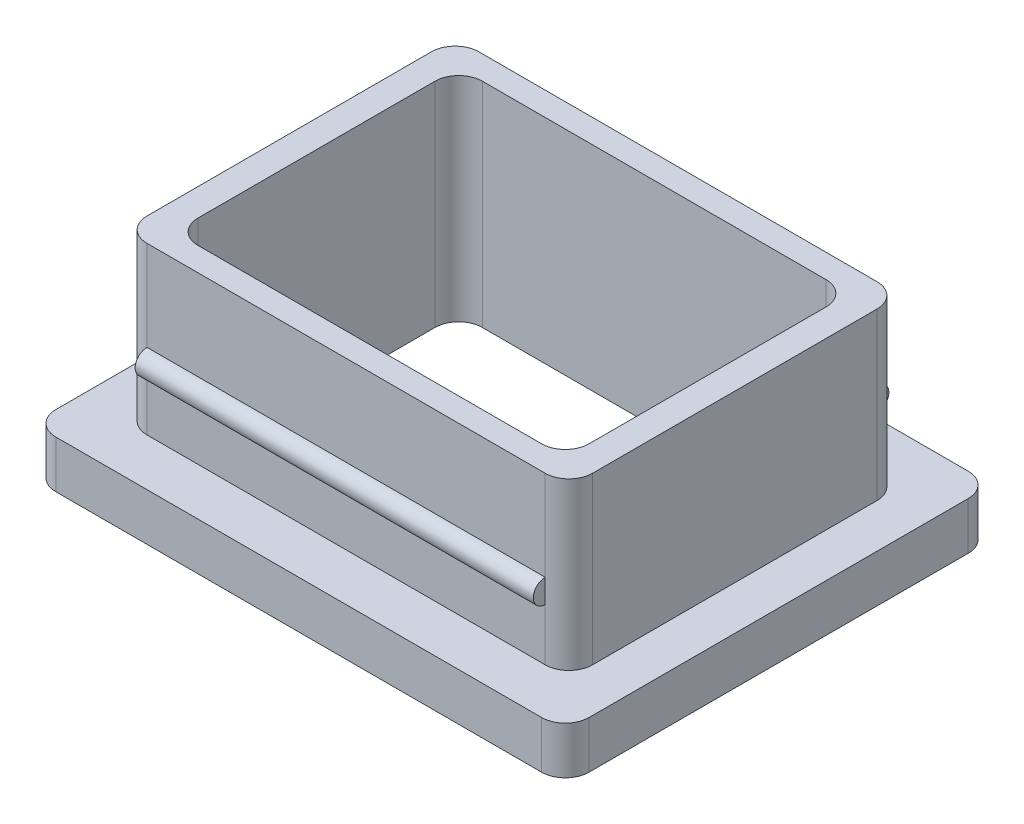
ISO-10303-21;
HEADER;
FILE_DESCRIPTION(('STEP AP214'),'2;1');
FILE_NAME('part.step','',(''),(''),'','','');
FILE_SCHEMA(('AUTOMOTIVE_DESIGN { 1 0 10303 214 1 1 1 1 }'));
ENDSEC;
DATA;
#1=APPLICATION_CONTEXT('core data for automotive mechanical design processes');
#2=APPLICATION_PROTOCOL_DEFINITION('international standard','automotive_design',2000,#1);
#3=PRODUCT_CONTEXT('',#1,'mechanical');
#4=PRODUCT('Part','Part','',(#3));
#5=PRODUCT_RELATED_PRODUCT_CATEGORY('part','',(#4));
#6=PRODUCT_DEFINITION_FORMATION('','',#4);
#7=PRODUCT_DEFINITION_CONTEXT('part definition',#1,'design');
#8=PRODUCT_DEFINITION('design','',#6,#7);
#9=PRODUCT_DEFINITION_SHAPE('','',#8);
#10=(LENGTH_UNIT() NAMED_UNIT(*) SI_UNIT(.MILLI.,.METRE.));
#11=(NAMED_UNIT(*) PLANE_ANGLE_UNIT() SI_UNIT($,.RADIAN.));
#12=(NAMED_UNIT(*) SI_UNIT($,.STERADIAN.) SOLID_ANGLE_UNIT());
#13=UNCERTAINTY_MEASURE_WITH_UNIT(LENGTH_MEASURE(1.E-05),#10,'distance_accuracy_value','');
#14=(GEOMETRIC_REPRESENTATION_CONTEXT(3) GLOBAL_UNCERTAINTY_ASSIGNED_CONTEXT((#13)) GLOBAL_UNIT_ASSIGNED_CONTEXT((#10,
#11,#12)) REPRESENTATION_CONTEXT('',''));
#15=CARTESIAN_POINT('',(0.,0.,0.));
#16=DIRECTION('',(0.,0.,1.));
#17=DIRECTION('',(1.,0.,0.));
#18=AXIS2_PLACEMENT_3D('',#15,#16,#17);
#19=CARTESIAN_POINT('',(-9.4,7.,7.));
#20=DIRECTION('',(0.,0.,-1.));
#21=DIRECTION('',(-1.,0.,0.));
#22=AXIS2_PLACEMENT_3D('',#19,#20,#21);
#23=PLANE('',#22);
#24=DIRECTION('',(0.,-1.,0.));
#25=VECTOR('',#24,1.);
#26=CARTESIAN_POINT('',(8.4,7.,7.));
#27=LINE('',#26,#25);
#28=CARTESIAN_POINT('',(8.4,0.,7.));
#29=VERTEX_POINT('',#28);
#30=CARTESIAN_POINT('',(8.4,2.2,7.));
#31=VERTEX_POINT('',#30);
#32=EDGE_CURVE('E246',#29,#31,#27,.F.);
#33=ORIENTED_EDGE('',*,*,#32,.T.);
#34=DIRECTION('',(-1.,0.,0.));
#35=VECTOR('',#34,1.);
#36=CARTESIAN_POINT('',(8.4,2.2,7.));
#37=LINE('',#36,#35);
#38=CARTESIAN_POINT('',(-8.4,2.2,7.));
#39=VERTEX_POINT('',#38);
#40=EDGE_CURVE('E245',#31,#39,#37,.T.);
#41=ORIENTED_EDGE('',*,*,#40,.T.);
#42=DIRECTION('',(0.,-1.,0.));
#43=VECTOR('',#42,1.);
#44=CARTESIAN_POINT('',(-8.4,7.,7.));
#45=LINE('',#44,#43);
#46=CARTESIAN_POINT('',(-8.4,0.,7.));
#47=VERTEX_POINT('',#46);
#48=EDGE_CURVE('E228',#39,#47,#45,.T.);
#49=ORIENTED_EDGE('',*,*,#48,.T.);
#50=DIRECTION('',(1.,0.,0.));
#51=VECTOR('',#50,1.);
#52=CARTESIAN_POINT('',(-9.4,0.,7.));
#53=LINE('',#52,#51);
#54=EDGE_CURVE('E361',#47,#29,#53,.T.);
#55=ORIENTED_EDGE('',*,*,#54,.T.);
#56=EDGE_LOOP('',(#33,#41,#49,#55));
#57=FACE_BOUND('',#56,.T.);
#58=ADVANCED_FACE('F42',(#57),#23,.F.);
#59=CARTESIAN_POINT('',(-9.4,7.,-7.));
#60=DIRECTION('',(0.,0.,1.));
#61=DIRECTION('',(1.,0.,0.));
#62=AXIS2_PLACEMENT_3D('',#59,#60,#61);
#63=PLANE('',#62);
#64=DIRECTION('',(-1.,0.,0.));
#65=VECTOR('',#64,1.);
#66=CARTESIAN_POINT('',(8.4,3.2,-7.));
#67=LINE('',#66,#65);
#68=CARTESIAN_POINT('',(8.4,3.2,-7.));
#69=VERTEX_POINT('',#68);
#70=CARTESIAN_POINT('',(-8.4,3.2,-7.));
#71=VERTEX_POINT('',#70);
#72=EDGE_CURVE('E277',#69,#71,#67,.T.);
#73=ORIENTED_EDGE('',*,*,#72,.T.);
#74=DIRECTION('',(0.,-1.,0.));
#75=VECTOR('',#74,1.);
#76=CARTESIAN_POINT('',(-8.4,7.,-7.));
#77=LINE('',#76,#75);
#78=CARTESIAN_POINT('',(-8.4,7.,-7.));
#79=VERTEX_POINT('',#78);
#80=EDGE_CURVE('E415',#71,#79,#77,.F.);
#81=ORIENTED_EDGE('',*,*,#80,.T.);
#82=DIRECTION('',(-1.,0.,0.));
#83=VECTOR('',#82,1.);
#84=CARTESIAN_POINT('',(-9.4,7.,-7.));
#85=LINE('',#84,#83);
#86=CARTESIAN_POINT('',(8.4,7.,-7.));
#87=VERTEX_POINT('',#86);
#88=EDGE_CURVE('E360',#87,#79,#85,.T.);
#89=ORIENTED_EDGE('',*,*,#88,.F.);
#90=DIRECTION('',(0.,-1.,0.));
#91=VECTOR('',#90,1.);
#92=CARTESIAN_POINT('',(8.4,7.,-7.));
#93=LINE('',#92,#91);
#94=EDGE_CURVE('E421',#87,#69,#93,.T.);
#95=ORIENTED_EDGE('',*,*,#94,.T.);
#96=EDGE_LOOP('',(#73,#81,#89,#95));
#97=FACE_BOUND('',#96,.T.);
#98=ADVANCED_FACE('F585',(#97),#63,.F.);
#99=DIRECTION('',(-1.,0.,0.));
#100=VECTOR('',#99,1.);
#101=CARTESIAN_POINT('',(8.4,2.2,-7.));
#102=LINE('',#101,#100);
#103=CARTESIAN_POINT('',(8.4,2.2,-7.));
#104=VERTEX_POINT('',#103);
#105=CARTESIAN_POINT('',(-8.4,2.2,-7.));
#106=VERTEX_POINT('',#105);
#107=EDGE_CURVE('E287',#104,#106,#102,.T.);
#108=ORIENTED_EDGE('',*,*,#107,.F.);
#109=CARTESIAN_POINT('',(8.4,0.,-7.));
#110=VERTEX_POINT('',#109);
#111=EDGE_CURVE('E420',#104,#110,#93,.T.);
#112=ORIENTED_EDGE('',*,*,#111,.T.);
#113=DIRECTION('',(-1.,0.,0.));
#114=VECTOR('',#113,1.);
#115=CARTESIAN_POINT('',(-9.4,0.,-7.));
#116=LINE('',#115,#114);
#117=CARTESIAN_POINT('',(-8.4,0.,-7.));
#118=VERTEX_POINT('',#117);
#119=EDGE_CURVE('E377',#110,#118,#116,.T.);
#120=ORIENTED_EDGE('',*,*,#119,.T.);
#121=EDGE_CURVE('E416',#118,#106,#77,.F.);
#122=ORIENTED_EDGE('',*,*,#121,.T.);
#123=EDGE_LOOP('',(#108,#112,#120,#122));
#124=FACE_BOUND('',#123,.T.);
#125=ADVANCED_FACE('F591',(#124),#63,.F.);
#126=CARTESIAN_POINT('',(0.,7.,0.));
#127=DIRECTION('',(0.,-1.,0.));
#128=DIRECTION('',(0.,0.,-1.));
#129=AXIS2_PLACEMENT_3D('',#126,#127,#128);
#130=PLANE('',#129);
#131=DIRECTION('',(1.,0.,0.));
#132=VECTOR('',#131,1.);
#133=CARTESIAN_POINT('',(-9.4,7.,7.));
#134=LINE('',#133,#132);
#135=CARTESIAN_POINT('',(-8.4,7.,7.));
#136=VERTEX_POINT('',#135);
#137=CARTESIAN_POINT('',(8.4,7.,7.));
#138=VERTEX_POINT('',#137);
#139=EDGE_CURVE('E369',#136,#138,#134,.T.);
#140=ORIENTED_EDGE('',*,*,#139,.T.);
#141=CARTESIAN_POINT('',(8.4,7.,6.));
#142=DIRECTION('',(0.,-1.,0.));
#143=DIRECTION('',(0.,0.,-1.));
#144=AXIS2_PLACEMENT_3D('',#141,#142,#143);
#145=CIRCLE('',#144,1.);
#146=CARTESIAN_POINT('',(9.4,7.,6.));
#147=VERTEX_POINT('',#146);
#148=EDGE_CURVE('E405',#138,#147,#145,.F.);
#149=ORIENTED_EDGE('',*,*,#148,.T.);
#150=DIRECTION('',(0.,0.,-1.));
#151=VECTOR('',#150,1.);
#152=CARTESIAN_POINT('',(9.4,7.,7.));
#153=LINE('',#152,#151);
#154=CARTESIAN_POINT('',(9.4,7.,-6.));
#155=VERTEX_POINT('',#154);
#156=EDGE_CURVE('E356',#147,#155,#153,.T.);
#157=ORIENTED_EDGE('',*,*,#156,.T.);
#158=CARTESIAN_POINT('',(8.4,7.,-6.));
#159=DIRECTION('',(0.,-1.,0.));
#160=DIRECTION('',(0.,0.,-1.));
#161=AXIS2_PLACEMENT_3D('',#158,#159,#160);
#162=CIRCLE('',#161,1.);
#163=EDGE_CURVE('E399',#155,#87,#162,.F.);
#164=ORIENTED_EDGE('',*,*,#163,.T.);
#165=ORIENTED_EDGE('',*,*,#88,.T.);
#166=CARTESIAN_POINT('',(-8.4,7.,-6.));
#167=DIRECTION('',(0.,-1.,0.));
#168=DIRECTION('',(0.,0.,-1.));
#169=AXIS2_PLACEMENT_3D('',#166,#167,#168);
#170=CIRCLE('',#169,1.);
#171=CARTESIAN_POINT('',(-9.4,7.,-6.));
#172=VERTEX_POINT('',#171);
#173=EDGE_CURVE('E396',#79,#172,#170,.F.);
#174=ORIENTED_EDGE('',*,*,#173,.T.);
#175=DIRECTION('',(0.,0.,1.));
#176=VECTOR('',#175,1.);
#177=CARTESIAN_POINT('',(-9.4,7.,7.));
#178=LINE('',#177,#176);
#179=CARTESIAN_POINT('',(-9.4,7.,6.));
#180=VERTEX_POINT('',#179);
#181=EDGE_CURVE('E365',#172,#180,#178,.T.);
#182=ORIENTED_EDGE('',*,*,#181,.T.);
#183=CARTESIAN_POINT('',(-8.4,7.,6.));
#184=DIRECTION('',(0.,-1.,0.));
#185=DIRECTION('',(0.,0.,-1.));
#186=AXIS2_PLACEMENT_3D('',#183,#184,#185);
#187=CIRCLE('',#186,1.);
#188=EDGE_CURVE('E402',#180,#136,#187,.F.);
#189=ORIENTED_EDGE('',*,*,#188,.T.);
#190=EDGE_LOOP('',(#140,#149,#157,#164,#165,#174,#182,#189));
#191=FACE_BOUND('',#190,.T.);
#192=DIRECTION('',(0.,0.,-1.));
#193=VECTOR('',#192,1.);
#194=CARTESIAN_POINT('',(8.25,7.,6.));
#195=LINE('',#194,#193);
#196=CARTESIAN_POINT('',(8.25,7.,5.));
#197=VERTEX_POINT('',#196);
#198=CARTESIAN_POINT('',(8.25,7.,-5.));
#199=VERTEX_POINT('',#198);
#200=EDGE_CURVE('E325',#197,#199,#195,.T.);
#201=ORIENTED_EDGE('',*,*,#200,.F.);
#202=CARTESIAN_POINT('',(7.25,7.,5.));
#203=DIRECTION('',(0.,-1.,0.));
#204=DIRECTION('',(0.,0.,-1.));
#205=AXIS2_PLACEMENT_3D('',#202,#203,#204);
#206=CIRCLE('',#205,1.);
#207=CARTESIAN_POINT('',(7.25,7.,6.));
#208=VERTEX_POINT('',#207);
#209=EDGE_CURVE('E519',#197,#208,#206,.T.);
#210=ORIENTED_EDGE('',*,*,#209,.T.);
#211=DIRECTION('',(1.,0.,0.));
#212=VECTOR('',#211,1.);
#213=CARTESIAN_POINT('',(-8.25,7.,6.));
#214=LINE('',#213,#212);
#215=CARTESIAN_POINT('',(-7.25,7.,6.));
#216=VERTEX_POINT('',#215);
#217=EDGE_CURVE('E351',#216,#208,#214,.T.);
#218=ORIENTED_EDGE('',*,*,#217,.F.);
#219=CARTESIAN_POINT('',(-7.25,7.,5.));
#220=DIRECTION('',(0.,-1.,0.));
#221=DIRECTION('',(0.,0.,-1.));
#222=AXIS2_PLACEMENT_3D('',#219,#220,#221);
#223=CIRCLE('',#222,1.);
#224=CARTESIAN_POINT('',(-8.25,7.,5.));
#225=VERTEX_POINT('',#224);
#226=EDGE_CURVE('E531',#216,#225,#223,.T.);
#227=ORIENTED_EDGE('',*,*,#226,.T.);
#228=DIRECTION('',(0.,0.,1.));
#229=VECTOR('',#228,1.);
#230=CARTESIAN_POINT('',(-8.25,7.,6.));
#231=LINE('',#230,#229);
#232=CARTESIAN_POINT('',(-8.25,7.,-5.));
#233=VERTEX_POINT('',#232);
#234=EDGE_CURVE('E347',#233,#225,#231,.T.);
#235=ORIENTED_EDGE('',*,*,#234,.F.);
#236=CARTESIAN_POINT('',(-7.25,7.,-5.));
#237=DIRECTION('',(0.,-1.,0.));
#238=DIRECTION('',(0.,0.,-1.));
#239=AXIS2_PLACEMENT_3D('',#236,#237,#238);
#240=CIRCLE('',#239,1.);
#241=CARTESIAN_POINT('',(-7.25,7.,-6.));
#242=VERTEX_POINT('',#241);
#243=EDGE_CURVE('E12',#233,#242,#240,.T.);
#244=ORIENTED_EDGE('',*,*,#243,.T.);
#245=DIRECTION('',(-1.,0.,0.));
#246=VECTOR('',#245,1.);
#247=CARTESIAN_POINT('',(-8.25,7.,-6.));
#248=LINE('',#247,#246);
#249=CARTESIAN_POINT('',(7.25,7.,-6.));
#250=VERTEX_POINT('',#249);
#251=EDGE_CURVE('E343',#250,#242,#248,.T.);
#252=ORIENTED_EDGE('',*,*,#251,.F.);
#253=CARTESIAN_POINT('',(7.25,7.,-5.));
#254=DIRECTION('',(0.,-1.,0.));
#255=DIRECTION('',(0.,0.,-1.));
#256=AXIS2_PLACEMENT_3D('',#253,#254,#255);
#257=CIRCLE('',#256,1.);
#258=EDGE_CURVE('E525',#250,#199,#257,.T.);
#259=ORIENTED_EDGE('',*,*,#258,.T.);
#260=EDGE_LOOP('',(#201,#210,#218,#227,#235,#244,#252,#259));
#261=FACE_BOUND('',#260,.T.);
#262=ADVANCED_FACE('F551',(#191,#261),#130,.F.);
#263=CARTESIAN_POINT('',(9.4,7.,7.));
#264=DIRECTION('',(-1.,0.,0.));
#265=DIRECTION('',(0.,0.,1.));
#266=AXIS2_PLACEMENT_3D('',#263,#264,#265);
#267=PLANE('',#266);
#268=ORIENTED_EDGE('',*,*,#156,.F.);
#269=DIRECTION('',(0.,-1.,0.));
#270=VECTOR('',#269,1.);
#271=CARTESIAN_POINT('',(9.4,7.,6.));
#272=LINE('',#271,#270);
#273=CARTESIAN_POINT('',(9.4,0.,6.));
#274=VERTEX_POINT('',#273);
#275=EDGE_CURVE('E242',#147,#274,#272,.T.);
#276=ORIENTED_EDGE('',*,*,#275,.T.);
#277=DIRECTION('',(0.,0.,-1.));
#278=VECTOR('',#277,1.);
#279=CARTESIAN_POINT('',(9.4,0.,7.));
#280=LINE('',#279,#278);
#281=CARTESIAN_POINT('',(9.4,0.,-6.));
#282=VERTEX_POINT('',#281);
#283=EDGE_CURVE('E355',#274,#282,#280,.T.);
#284=ORIENTED_EDGE('',*,*,#283,.T.);
#285=DIRECTION('',(0.,-1.,0.));
#286=VECTOR('',#285,1.);
#287=CARTESIAN_POINT('',(9.4,7.,-6.));
#288=LINE('',#287,#286);
#289=EDGE_CURVE('E373',#282,#155,#288,.F.);
#290=ORIENTED_EDGE('',*,*,#289,.T.);
#291=EDGE_LOOP('',(#268,#276,#284,#290));
#292=FACE_BOUND('',#291,.T.);
#293=ADVANCED_FACE('F603',(#292),#267,.F.);
#294=CARTESIAN_POINT('',(-9.4,7.,7.));
#295=DIRECTION('',(1.,0.,0.));
#296=DIRECTION('',(0.,0.,-1.));
#297=AXIS2_PLACEMENT_3D('',#294,#295,#296);
#298=PLANE('',#297);
#299=DIRECTION('',(0.,0.,1.));
#300=VECTOR('',#299,1.);
#301=CARTESIAN_POINT('',(-9.4,0.,7.));
#302=LINE('',#301,#300);
#303=CARTESIAN_POINT('',(-9.4,0.,-6.));
#304=VERTEX_POINT('',#303);
#305=CARTESIAN_POINT('',(-9.4,0.,6.));
#306=VERTEX_POINT('',#305);
#307=EDGE_CURVE('E381',#304,#306,#302,.T.);
#308=ORIENTED_EDGE('',*,*,#307,.T.);
#309=DIRECTION('',(0.,-1.,0.));
#310=VECTOR('',#309,1.);
#311=CARTESIAN_POINT('',(-9.4,7.,6.));
#312=LINE('',#311,#310);
#313=EDGE_CURVE('E412',#306,#180,#312,.F.);
#314=ORIENTED_EDGE('',*,*,#313,.T.);
#315=ORIENTED_EDGE('',*,*,#181,.F.);
#316=DIRECTION('',(0.,-1.,0.));
#317=VECTOR('',#316,1.);
#318=CARTESIAN_POINT('',(-9.4,7.,-6.));
#319=LINE('',#318,#317);
#320=EDGE_CURVE('E408',#172,#304,#319,.T.);
#321=ORIENTED_EDGE('',*,*,#320,.T.);
#322=EDGE_LOOP('',(#308,#314,#315,#321));
#323=FACE_BOUND('',#322,.T.);
#324=ADVANCED_FACE('F597',(#323),#298,.F.);
#325=CARTESIAN_POINT('',(-8.4,3.2,7.));
#326=VERTEX_POINT('',#325);
#327=EDGE_CURVE('E241',#136,#326,#45,.T.);
#328=ORIENTED_EDGE('',*,*,#327,.T.);
#329=DIRECTION('',(-1.,0.,0.));
#330=VECTOR('',#329,1.);
#331=CARTESIAN_POINT('',(8.4,3.2,7.));
#332=LINE('',#331,#330);
#333=CARTESIAN_POINT('',(8.4,3.2,7.));
#334=VERTEX_POINT('',#333);
#335=EDGE_CURVE('E58',#334,#326,#332,.T.);
#336=ORIENTED_EDGE('',*,*,#335,.F.);
#337=EDGE_CURVE('E393',#334,#138,#27,.F.);
#338=ORIENTED_EDGE('',*,*,#337,.T.);
#339=ORIENTED_EDGE('',*,*,#139,.F.);
#340=EDGE_LOOP('',(#328,#336,#338,#339));
#341=FACE_BOUND('',#340,.T.);
#342=ADVANCED_FACE('F587',(#341),#23,.F.);
#343=CARTESIAN_POINT('',(8.25,7.,6.));
#344=DIRECTION('',(-1.,0.,0.));
#345=DIRECTION('',(0.,0.,1.));
#346=AXIS2_PLACEMENT_3D('',#343,#344,#345);
#347=PLANE('',#346);
#348=DIRECTION('',(0.,0.,-1.));
#349=VECTOR('',#348,1.);
#350=CARTESIAN_POINT('',(8.25,-2.,0.));
#351=LINE('',#350,#349);
#352=CARTESIAN_POINT('',(8.25,-2.,5.));
#353=VERTEX_POINT('',#352);
#354=CARTESIAN_POINT('',(8.25,-2.,-5.));
#355=VERTEX_POINT('',#354);
#356=EDGE_CURVE('E301',#353,#355,#351,.T.);
#357=ORIENTED_EDGE('',*,*,#356,.F.);
#358=DIRECTION('',(0.,-1.,0.));
#359=VECTOR('',#358,1.);
#360=CARTESIAN_POINT('',(8.25,7.,5.));
#361=LINE('',#360,#359);
#362=EDGE_CURVE('E436',#353,#197,#361,.F.);
#363=ORIENTED_EDGE('',*,*,#362,.T.);
#364=ORIENTED_EDGE('',*,*,#200,.T.);
#365=DIRECTION('',(0.,-1.,0.));
#366=VECTOR('',#365,1.);
#367=CARTESIAN_POINT('',(8.25,-2.,-5.));
#368=LINE('',#367,#366);
#369=EDGE_CURVE('E432',#199,#355,#368,.T.);
#370=ORIENTED_EDGE('',*,*,#369,.T.);
#371=EDGE_LOOP('',(#357,#363,#364,#370));
#372=FACE_BOUND('',#371,.T.);
#373=ADVANCED_FACE('F562',(#372),#347,.T.);
#374=CARTESIAN_POINT('',(-8.25,7.,-6.));
#375=DIRECTION('',(0.,0.,1.));
#376=DIRECTION('',(1.,0.,0.));
#377=AXIS2_PLACEMENT_3D('',#374,#375,#376);
#378=PLANE('',#377);
#379=DIRECTION('',(-1.,0.,0.));
#380=VECTOR('',#379,1.);
#381=CARTESIAN_POINT('',(0.,-2.,-6.));
#382=LINE('',#381,#380);
#383=CARTESIAN_POINT('',(7.25,-2.,-6.));
#384=VERTEX_POINT('',#383);
#385=CARTESIAN_POINT('',(-7.25,-2.,-6.));
#386=VERTEX_POINT('',#385);
#387=EDGE_CURVE('E296',#384,#386,#382,.T.);
#388=ORIENTED_EDGE('',*,*,#387,.F.);
#389=DIRECTION('',(0.,-1.,0.));
#390=VECTOR('',#389,1.);
#391=CARTESIAN_POINT('',(7.25,7.,-6.));
#392=LINE('',#391,#390);
#393=EDGE_CURVE('E443',#384,#250,#392,.F.);
#394=ORIENTED_EDGE('',*,*,#393,.T.);
#395=ORIENTED_EDGE('',*,*,#251,.T.);
#396=DIRECTION('',(0.,-1.,0.));
#397=VECTOR('',#396,1.);
#398=CARTESIAN_POINT('',(-7.25,-2.,-6.));
#399=LINE('',#398,#397);
#400=EDGE_CURVE('E439',#242,#386,#399,.T.);
#401=ORIENTED_EDGE('',*,*,#400,.T.);
#402=EDGE_LOOP('',(#388,#394,#395,#401));
#403=FACE_BOUND('',#402,.T.);
#404=ADVANCED_FACE('F554',(#403),#378,.T.);
#405=CARTESIAN_POINT('',(-8.25,7.,6.));
#406=DIRECTION('',(1.,0.,0.));
#407=DIRECTION('',(0.,0.,-1.));
#408=AXIS2_PLACEMENT_3D('',#405,#406,#407);
#409=PLANE('',#408);
#410=ORIENTED_EDGE('',*,*,#234,.T.);
#411=DIRECTION('',(0.,-1.,0.));
#412=VECTOR('',#411,1.);
#413=CARTESIAN_POINT('',(-8.25,-2.,5.));
#414=LINE('',#413,#412);
#415=CARTESIAN_POINT('',(-8.25,-2.,5.));
#416=VERTEX_POINT('',#415);
#417=EDGE_CURVE('E449',#225,#416,#414,.T.);
#418=ORIENTED_EDGE('',*,*,#417,.T.);
#419=DIRECTION('',(0.,0.,1.));
#420=VECTOR('',#419,1.);
#421=CARTESIAN_POINT('',(-8.25,-2.,0.));
#422=LINE('',#421,#420);
#423=CARTESIAN_POINT('',(-8.25,-2.,-5.));
#424=VERTEX_POINT('',#423);
#425=EDGE_CURVE('E292',#424,#416,#422,.T.);
#426=ORIENTED_EDGE('',*,*,#425,.F.);
#427=DIRECTION('',(0.,-1.,0.));
#428=VECTOR('',#427,1.);
#429=CARTESIAN_POINT('',(-8.25,7.,-5.));
#430=LINE('',#429,#428);
#431=EDGE_CURVE('E446',#424,#233,#430,.F.);
#432=ORIENTED_EDGE('',*,*,#431,.T.);
#433=EDGE_LOOP('',(#410,#418,#426,#432));
#434=FACE_BOUND('',#433,.T.);
#435=ADVANCED_FACE('F543',(#434),#409,.T.);
#436=CARTESIAN_POINT('',(-8.25,7.,6.));
#437=DIRECTION('',(0.,0.,-1.));
#438=DIRECTION('',(-1.,0.,0.));
#439=AXIS2_PLACEMENT_3D('',#436,#437,#438);
#440=PLANE('',#439);
#441=ORIENTED_EDGE('',*,*,#217,.T.);
#442=DIRECTION('',(0.,-1.,0.));
#443=VECTOR('',#442,1.);
#444=CARTESIAN_POINT('',(7.25,-2.,6.));
#445=LINE('',#444,#443);
#446=CARTESIAN_POINT('',(7.25,-2.,6.));
#447=VERTEX_POINT('',#446);
#448=EDGE_CURVE('E428',#208,#447,#445,.T.);
#449=ORIENTED_EDGE('',*,*,#448,.T.);
#450=DIRECTION('',(1.,0.,0.));
#451=VECTOR('',#450,1.);
#452=CARTESIAN_POINT('',(0.,-2.,6.));
#453=LINE('',#452,#451);
#454=CARTESIAN_POINT('',(-7.25,-2.,6.));
#455=VERTEX_POINT('',#454);
#456=EDGE_CURVE('E305',#455,#447,#453,.T.);
#457=ORIENTED_EDGE('',*,*,#456,.F.);
#458=DIRECTION('',(0.,-1.,0.));
#459=VECTOR('',#458,1.);
#460=CARTESIAN_POINT('',(-7.25,7.,6.));
#461=LINE('',#460,#459);
#462=EDGE_CURVE('E425',#455,#216,#461,.F.);
#463=ORIENTED_EDGE('',*,*,#462,.T.);
#464=EDGE_LOOP('',(#441,#449,#457,#463));
#465=FACE_BOUND('',#464,.T.);
#466=ADVANCED_FACE('F570',(#465),#440,.T.);
#467=CARTESIAN_POINT('',(0.,0.,0.));
#468=DIRECTION('',(0.,1.,0.));
#469=DIRECTION('',(0.,0.,1.));
#470=AXIS2_PLACEMENT_3D('',#467,#468,#469);
#471=PLANE('',#470);
#472=DIRECTION('',(0.,0.,1.));
#473=VECTOR('',#472,1.);
#474=CARTESIAN_POINT('',(11.25,0.,0.));
#475=LINE('',#474,#473);
#476=CARTESIAN_POINT('',(11.25,0.,-8.));
#477=VERTEX_POINT('',#476);
#478=CARTESIAN_POINT('',(11.25,0.,8.));
#479=VERTEX_POINT('',#478);
#480=EDGE_CURVE('E291',#477,#479,#475,.T.);
#481=ORIENTED_EDGE('',*,*,#480,.F.);
#482=CARTESIAN_POINT('',(10.25,0.,-8.));
#483=DIRECTION('',(0.,1.,0.));
#484=DIRECTION('',(0.,0.,1.));
#485=AXIS2_PLACEMENT_3D('',#482,#483,#484);
#486=CIRCLE('',#485,1.);
#487=CARTESIAN_POINT('',(10.25,0.,-9.));
#488=VERTEX_POINT('',#487);
#489=EDGE_CURVE('E469',#477,#488,#486,.T.);
#490=ORIENTED_EDGE('',*,*,#489,.T.);
#491=DIRECTION('',(1.,0.,0.));
#492=VECTOR('',#491,1.);
#493=CARTESIAN_POINT('',(0.,0.,-9.));
#494=LINE('',#493,#492);
#495=CARTESIAN_POINT('',(-10.25,0.,-9.));
#496=VERTEX_POINT('',#495);
#497=EDGE_CURVE('E329',#496,#488,#494,.T.);
#498=ORIENTED_EDGE('',*,*,#497,.F.);
#499=CARTESIAN_POINT('',(-10.25,0.,-8.));
#500=DIRECTION('',(0.,1.,0.));
#501=DIRECTION('',(0.,0.,1.));
#502=AXIS2_PLACEMENT_3D('',#499,#500,#501);
#503=CIRCLE('',#502,1.);
#504=CARTESIAN_POINT('',(-11.25,0.,-8.));
#505=VERTEX_POINT('',#504);
#506=EDGE_CURVE('E466',#496,#505,#503,.T.);
#507=ORIENTED_EDGE('',*,*,#506,.T.);
#508=DIRECTION('',(0.,0.,1.));
#509=VECTOR('',#508,1.);
#510=CARTESIAN_POINT('',(-11.25,0.,0.));
#511=LINE('',#510,#509);
#512=CARTESIAN_POINT('',(-11.25,0.,8.));
#513=VERTEX_POINT('',#512);
#514=EDGE_CURVE('E333',#505,#513,#511,.T.);
#515=ORIENTED_EDGE('',*,*,#514,.T.);
#516=CARTESIAN_POINT('',(-10.25,0.,8.));
#517=DIRECTION('',(0.,1.,0.));
#518=DIRECTION('',(0.,0.,1.));
#519=AXIS2_PLACEMENT_3D('',#516,#517,#518);
#520=CIRCLE('',#519,1.);
#521=CARTESIAN_POINT('',(-10.25,0.,9.));
#522=VERTEX_POINT('',#521);
#523=EDGE_CURVE('E460',#513,#522,#520,.T.);
#524=ORIENTED_EDGE('',*,*,#523,.T.);
#525=DIRECTION('',(1.,0.,0.));
#526=VECTOR('',#525,1.);
#527=CARTESIAN_POINT('',(0.,0.,9.));
#528=LINE('',#527,#526);
#529=CARTESIAN_POINT('',(10.25,0.,9.));
#530=VERTEX_POINT('',#529);
#531=EDGE_CURVE('E297',#522,#530,#528,.T.);
#532=ORIENTED_EDGE('',*,*,#531,.T.);
#533=CARTESIAN_POINT('',(10.25,0.,8.));
#534=DIRECTION('',(0.,1.,0.));
#535=DIRECTION('',(0.,0.,1.));
#536=AXIS2_PLACEMENT_3D('',#533,#534,#535);
#537=CIRCLE('',#536,1.);
#538=EDGE_CURVE('E463',#530,#479,#537,.T.);
#539=ORIENTED_EDGE('',*,*,#538,.T.);
#540=EDGE_LOOP('',(#481,#490,#498,#507,#515,#524,#532,#539));
#541=FACE_BOUND('',#540,.T.);
#542=ORIENTED_EDGE('',*,*,#283,.F.);
#543=CARTESIAN_POINT('',(8.4,0.,6.));
#544=DIRECTION('',(0.,1.,0.));
#545=DIRECTION('',(0.,0.,1.));
#546=AXIS2_PLACEMENT_3D('',#543,#544,#545);
#547=CIRCLE('',#546,1.);
#548=EDGE_CURVE('E505',#274,#29,#547,.F.);
#549=ORIENTED_EDGE('',*,*,#548,.T.);
#550=ORIENTED_EDGE('',*,*,#54,.F.);
#551=CARTESIAN_POINT('',(-8.4,0.,6.));
#552=DIRECTION('',(0.,1.,0.));
#553=DIRECTION('',(0.,0.,1.));
#554=AXIS2_PLACEMENT_3D('',#551,#552,#553);
#555=CIRCLE('',#554,1.);
#556=EDGE_CURVE('E236',#47,#306,#555,.F.);
#557=ORIENTED_EDGE('',*,*,#556,.T.);
#558=ORIENTED_EDGE('',*,*,#307,.F.);
#559=CARTESIAN_POINT('',(-8.4,0.,-6.));
#560=DIRECTION('',(0.,1.,0.));
#561=DIRECTION('',(0.,0.,1.));
#562=AXIS2_PLACEMENT_3D('',#559,#560,#561);
#563=CIRCLE('',#562,1.);
#564=EDGE_CURVE('E513',#304,#118,#563,.F.);
#565=ORIENTED_EDGE('',*,*,#564,.T.);
#566=ORIENTED_EDGE('',*,*,#119,.F.);
#567=CARTESIAN_POINT('',(8.4,0.,-6.));
#568=DIRECTION('',(0.,1.,0.));
#569=DIRECTION('',(0.,0.,1.));
#570=AXIS2_PLACEMENT_3D('',#567,#568,#569);
#571=CIRCLE('',#570,1.);
#572=EDGE_CURVE('E510',#110,#282,#571,.F.);
#573=ORIENTED_EDGE('',*,*,#572,.T.);
#574=EDGE_LOOP('',(#542,#549,#550,#557,#558,#565,#566,#573));
#575=FACE_BOUND('',#574,.T.);
#576=ADVANCED_FACE('F618',(#541,#575),#471,.T.);
#577=CARTESIAN_POINT('',(11.25,-2.,0.));
#578=DIRECTION('',(-1.,0.,0.));
#579=DIRECTION('',(0.,0.,1.));
#580=AXIS2_PLACEMENT_3D('',#577,#578,#579);
#581=PLANE('',#580);
#582=DIRECTION('',(0.,0.,1.));
#583=VECTOR('',#582,1.);
#584=CARTESIAN_POINT('',(11.25,-2.,0.));
#585=LINE('',#584,#583);
#586=CARTESIAN_POINT('',(11.25,-2.,-8.));
#587=VERTEX_POINT('',#586);
#588=CARTESIAN_POINT('',(11.25,-2.,8.));
#589=VERTEX_POINT('',#588);
#590=EDGE_CURVE('E309',#587,#589,#585,.T.);
#591=ORIENTED_EDGE('',*,*,#590,.F.);
#592=DIRECTION('',(0.,1.,0.));
#593=VECTOR('',#592,1.);
#594=CARTESIAN_POINT('',(11.25,-2.,-8.));
#595=LINE('',#594,#593);
#596=EDGE_CURVE('E456',#587,#477,#595,.T.);
#597=ORIENTED_EDGE('',*,*,#596,.T.);
#598=ORIENTED_EDGE('',*,*,#480,.T.);
#599=DIRECTION('',(0.,1.,0.));
#600=VECTOR('',#599,1.);
#601=CARTESIAN_POINT('',(11.25,-2.,8.));
#602=LINE('',#601,#600);
#603=EDGE_CURVE('E453',#479,#589,#602,.F.);
#604=ORIENTED_EDGE('',*,*,#603,.T.);
#605=EDGE_LOOP('',(#591,#597,#598,#604));
#606=FACE_BOUND('',#605,.T.);
#607=ADVANCED_FACE('F669',(#606),#581,.F.);
#608=CARTESIAN_POINT('',(0.,-2.,9.));
#609=DIRECTION('',(0.,0.,1.));
#610=DIRECTION('',(1.,0.,0.));
#611=AXIS2_PLACEMENT_3D('',#608,#609,#610);
#612=PLANE('',#611);
#613=DIRECTION('',(1.,0.,0.));
#614=VECTOR('',#613,1.);
#615=CARTESIAN_POINT('',(0.,-2.,9.));
#616=LINE('',#615,#614);
#617=CARTESIAN_POINT('',(-10.25,-2.,9.));
#618=VERTEX_POINT('',#617);
#619=CARTESIAN_POINT('',(10.25,-2.,9.));
#620=VERTEX_POINT('',#619);
#621=EDGE_CURVE('E321',#618,#620,#616,.T.);
#622=ORIENTED_EDGE('',*,*,#621,.T.);
#623=DIRECTION('',(0.,1.,0.));
#624=VECTOR('',#623,1.);
#625=CARTESIAN_POINT('',(10.25,0.,9.));
#626=LINE('',#625,#624);
#627=EDGE_CURVE('E501',#620,#530,#626,.T.);
#628=ORIENTED_EDGE('',*,*,#627,.T.);
#629=ORIENTED_EDGE('',*,*,#531,.F.);
#630=DIRECTION('',(0.,1.,0.));
#631=VECTOR('',#630,1.);
#632=CARTESIAN_POINT('',(-10.25,-2.,9.));
#633=LINE('',#632,#631);
#634=EDGE_CURVE('E498',#522,#618,#633,.F.);
#635=ORIENTED_EDGE('',*,*,#634,.T.);
#636=EDGE_LOOP('',(#622,#628,#629,#635));
#637=FACE_BOUND('',#636,.T.);
#638=ADVANCED_FACE('F671',(#637),#612,.T.);
#639=CARTESIAN_POINT('',(-11.25,-2.,0.));
#640=DIRECTION('',(-1.,0.,0.));
#641=DIRECTION('',(0.,0.,1.));
#642=AXIS2_PLACEMENT_3D('',#639,#640,#641);
#643=PLANE('',#642);
#644=ORIENTED_EDGE('',*,*,#514,.F.);
#645=DIRECTION('',(0.,1.,0.));
#646=VECTOR('',#645,1.);
#647=CARTESIAN_POINT('',(-11.25,-2.,-8.));
#648=LINE('',#647,#646);
#649=CARTESIAN_POINT('',(-11.25,-2.,-8.));
#650=VERTEX_POINT('',#649);
#651=EDGE_CURVE('E495',#505,#650,#648,.F.);
#652=ORIENTED_EDGE('',*,*,#651,.T.);
#653=DIRECTION('',(0.,0.,1.));
#654=VECTOR('',#653,1.);
#655=CARTESIAN_POINT('',(-11.25,-2.,0.));
#656=LINE('',#655,#654);
#657=CARTESIAN_POINT('',(-11.25,-2.,8.));
#658=VERTEX_POINT('',#657);
#659=EDGE_CURVE('E317',#650,#658,#656,.T.);
#660=ORIENTED_EDGE('',*,*,#659,.T.);
#661=DIRECTION('',(0.,1.,0.));
#662=VECTOR('',#661,1.);
#663=CARTESIAN_POINT('',(-11.25,-2.,8.));
#664=LINE('',#663,#662);
#665=EDGE_CURVE('E491',#658,#513,#664,.T.);
#666=ORIENTED_EDGE('',*,*,#665,.T.);
#667=EDGE_LOOP('',(#644,#652,#660,#666));
#668=FACE_BOUND('',#667,.T.);
#669=ADVANCED_FACE('F674',(#668),#643,.T.);
#670=CARTESIAN_POINT('',(0.,-2.,-9.));
#671=DIRECTION('',(0.,0.,1.));
#672=DIRECTION('',(1.,0.,0.));
#673=AXIS2_PLACEMENT_3D('',#670,#671,#672);
#674=PLANE('',#673);
#675=ORIENTED_EDGE('',*,*,#497,.T.);
#676=DIRECTION('',(0.,1.,0.));
#677=VECTOR('',#676,1.);
#678=CARTESIAN_POINT('',(10.25,-2.,-9.));
#679=LINE('',#678,#677);
#680=CARTESIAN_POINT('',(10.25,-2.,-9.));
#681=VERTEX_POINT('',#680);
#682=EDGE_CURVE('E476',#488,#681,#679,.F.);
#683=ORIENTED_EDGE('',*,*,#682,.T.);
#684=DIRECTION('',(1.,0.,0.));
#685=VECTOR('',#684,1.);
#686=CARTESIAN_POINT('',(0.,-2.,-9.));
#687=LINE('',#686,#685);
#688=CARTESIAN_POINT('',(-10.25,-2.,-9.));
#689=VERTEX_POINT('',#688);
#690=EDGE_CURVE('E313',#689,#681,#687,.T.);
#691=ORIENTED_EDGE('',*,*,#690,.F.);
#692=DIRECTION('',(0.,1.,0.));
#693=VECTOR('',#692,1.);
#694=CARTESIAN_POINT('',(-10.25,0.,-9.));
#695=LINE('',#694,#693);
#696=EDGE_CURVE('E472',#689,#496,#695,.T.);
#697=ORIENTED_EDGE('',*,*,#696,.T.);
#698=EDGE_LOOP('',(#675,#683,#691,#697));
#699=FACE_BOUND('',#698,.T.);
#700=ADVANCED_FACE('F666',(#699),#674,.F.);
#701=CARTESIAN_POINT('',(0.,-2.,0.));
#702=DIRECTION('',(0.,1.,0.));
#703=DIRECTION('',(0.,0.,1.));
#704=AXIS2_PLACEMENT_3D('',#701,#702,#703);
#705=PLANE('',#704);
#706=ORIENTED_EDGE('',*,*,#387,.T.);
#707=CARTESIAN_POINT('',(-7.25,-2.,-5.));
#708=DIRECTION('',(0.,1.,0.));
#709=DIRECTION('',(0.,0.,1.));
#710=AXIS2_PLACEMENT_3D('',#707,#708,#709);
#711=CIRCLE('',#710,1.);
#712=EDGE_CURVE('E51',#386,#424,#711,.T.);
#713=ORIENTED_EDGE('',*,*,#712,.T.);
#714=ORIENTED_EDGE('',*,*,#425,.T.);
#715=CARTESIAN_POINT('',(-7.25,-2.,5.));
#716=DIRECTION('',(0.,1.,0.));
#717=DIRECTION('',(0.,0.,1.));
#718=AXIS2_PLACEMENT_3D('',#715,#716,#717);
#719=CIRCLE('',#718,1.);
#720=EDGE_CURVE('E528',#416,#455,#719,.T.);
#721=ORIENTED_EDGE('',*,*,#720,.T.);
#722=ORIENTED_EDGE('',*,*,#456,.T.);
#723=CARTESIAN_POINT('',(7.25,-2.,5.));
#724=DIRECTION('',(0.,1.,0.));
#725=DIRECTION('',(0.,0.,1.));
#726=AXIS2_PLACEMENT_3D('',#723,#724,#725);
#727=CIRCLE('',#726,1.);
#728=EDGE_CURVE('E516',#447,#353,#727,.T.);
#729=ORIENTED_EDGE('',*,*,#728,.T.);
#730=ORIENTED_EDGE('',*,*,#356,.T.);
#731=CARTESIAN_POINT('',(7.25,-2.,-5.));
#732=DIRECTION('',(0.,1.,0.));
#733=DIRECTION('',(0.,0.,1.));
#734=AXIS2_PLACEMENT_3D('',#731,#732,#733);
#735=CIRCLE('',#734,1.);
#736=EDGE_CURVE('E522',#355,#384,#735,.T.);
#737=ORIENTED_EDGE('',*,*,#736,.T.);
#738=EDGE_LOOP('',(#706,#713,#714,#721,#722,#729,#730,#737));
#739=FACE_BOUND('',#738,.T.);
#740=ORIENTED_EDGE('',*,*,#690,.T.);
#741=CARTESIAN_POINT('',(10.25,-2.,-8.));
#742=DIRECTION('',(0.,1.,0.));
#743=DIRECTION('',(0.,0.,1.));
#744=AXIS2_PLACEMENT_3D('',#741,#742,#743);
#745=CIRCLE('',#744,1.);
#746=EDGE_CURVE('E488',#681,#587,#745,.F.);
#747=ORIENTED_EDGE('',*,*,#746,.T.);
#748=ORIENTED_EDGE('',*,*,#590,.T.);
#749=CARTESIAN_POINT('',(10.25,-2.,8.));
#750=DIRECTION('',(0.,1.,0.));
#751=DIRECTION('',(0.,0.,1.));
#752=AXIS2_PLACEMENT_3D('',#749,#750,#751);
#753=CIRCLE('',#752,1.);
#754=EDGE_CURVE('E482',#589,#620,#753,.F.);
#755=ORIENTED_EDGE('',*,*,#754,.T.);
#756=ORIENTED_EDGE('',*,*,#621,.F.);
#757=CARTESIAN_POINT('',(-10.25,-2.,8.));
#758=DIRECTION('',(0.,1.,0.));
#759=DIRECTION('',(0.,0.,1.));
#760=AXIS2_PLACEMENT_3D('',#757,#758,#759);
#761=CIRCLE('',#760,1.);
#762=EDGE_CURVE('E479',#618,#658,#761,.F.);
#763=ORIENTED_EDGE('',*,*,#762,.T.);
#764=ORIENTED_EDGE('',*,*,#659,.F.);
#765=CARTESIAN_POINT('',(-10.25,-2.,-8.));
#766=DIRECTION('',(0.,1.,0.));
#767=DIRECTION('',(0.,0.,1.));
#768=AXIS2_PLACEMENT_3D('',#765,#766,#767);
#769=CIRCLE('',#768,1.);
#770=EDGE_CURVE('E485',#650,#689,#769,.F.);
#771=ORIENTED_EDGE('',*,*,#770,.T.);
#772=EDGE_LOOP('',(#740,#747,#748,#755,#756,#763,#764,#771));
#773=FACE_BOUND('',#772,.T.);
#774=ADVANCED_FACE('F536',(#739,#773),#705,.F.);
#775=CARTESIAN_POINT('',(8.4,7.,6.));
#776=DIRECTION('',(0.,-1.,0.));
#777=DIRECTION('',(0.,0.,-1.));
#778=AXIS2_PLACEMENT_3D('',#775,#776,#777);
#779=CYLINDRICAL_SURFACE('',#778,1.);
#780=ORIENTED_EDGE('',*,*,#148,.F.);
#781=ORIENTED_EDGE('',*,*,#337,.F.);
#782=DIRECTION('',(0.,1.,0.));
#783=VECTOR('',#782,1.);
#784=CARTESIAN_POINT('',(8.4,0.,7.));
#785=LINE('',#784,#783);
#786=EDGE_CURVE('E65',#31,#334,#785,.T.);
#787=ORIENTED_EDGE('',*,*,#786,.F.);
#788=ORIENTED_EDGE('',*,*,#32,.F.);
#789=ORIENTED_EDGE('',*,*,#548,.F.);
#790=ORIENTED_EDGE('',*,*,#275,.F.);
#791=EDGE_LOOP('',(#780,#781,#787,#788,#789,#790));
#792=FACE_BOUND('',#791,.T.);
#793=ADVANCED_FACE('F631',(#792),#779,.T.);
#794=CARTESIAN_POINT('',(-8.4,7.,6.));
#795=DIRECTION('',(0.,-1.,0.));
#796=DIRECTION('',(0.,0.,-1.));
#797=AXIS2_PLACEMENT_3D('',#794,#795,#796);
#798=CYLINDRICAL_SURFACE('',#797,1.);
#799=ORIENTED_EDGE('',*,*,#188,.F.);
#800=ORIENTED_EDGE('',*,*,#313,.F.);
#801=ORIENTED_EDGE('',*,*,#556,.F.);
#802=ORIENTED_EDGE('',*,*,#48,.F.);
#803=DIRECTION('',(0.,1.,0.));
#804=VECTOR('',#803,1.);
#805=CARTESIAN_POINT('',(-8.4,0.,7.));
#806=LINE('',#805,#804);
#807=EDGE_CURVE('E234',#39,#326,#806,.T.);
#808=ORIENTED_EDGE('',*,*,#807,.T.);
#809=ORIENTED_EDGE('',*,*,#327,.F.);
#810=EDGE_LOOP('',(#799,#800,#801,#802,#808,#809));
#811=FACE_BOUND('',#810,.T.);
#812=ADVANCED_FACE('F231',(#811),#798,.T.);
#813=CARTESIAN_POINT('',(8.4,7.,-6.));
#814=DIRECTION('',(0.,-1.,0.));
#815=DIRECTION('',(0.,0.,-1.));
#816=AXIS2_PLACEMENT_3D('',#813,#814,#815);
#817=CYLINDRICAL_SURFACE('',#816,1.);
#818=ORIENTED_EDGE('',*,*,#163,.F.);
#819=ORIENTED_EDGE('',*,*,#289,.F.);
#820=ORIENTED_EDGE('',*,*,#572,.F.);
#821=ORIENTED_EDGE('',*,*,#111,.F.);
#822=DIRECTION('',(0.,1.,0.));
#823=VECTOR('',#822,1.);
#824=CARTESIAN_POINT('',(8.4,0.,-7.));
#825=LINE('',#824,#823);
#826=EDGE_CURVE('E269',#104,#69,#825,.T.);
#827=ORIENTED_EDGE('',*,*,#826,.T.);
#828=ORIENTED_EDGE('',*,*,#94,.F.);
#829=EDGE_LOOP('',(#818,#819,#820,#821,#827,#828));
#830=FACE_BOUND('',#829,.T.);
#831=ADVANCED_FACE('F627',(#830),#817,.T.);
#832=CARTESIAN_POINT('',(-8.4,7.,-6.));
#833=DIRECTION('',(0.,-1.,0.));
#834=DIRECTION('',(0.,0.,-1.));
#835=AXIS2_PLACEMENT_3D('',#832,#833,#834);
#836=CYLINDRICAL_SURFACE('',#835,1.);
#837=ORIENTED_EDGE('',*,*,#173,.F.);
#838=ORIENTED_EDGE('',*,*,#80,.F.);
#839=DIRECTION('',(0.,1.,0.));
#840=VECTOR('',#839,1.);
#841=CARTESIAN_POINT('',(-8.4,0.,-7.));
#842=LINE('',#841,#840);
#843=EDGE_CURVE('E252',#106,#71,#842,.T.);
#844=ORIENTED_EDGE('',*,*,#843,.F.);
#845=ORIENTED_EDGE('',*,*,#121,.F.);
#846=ORIENTED_EDGE('',*,*,#564,.F.);
#847=ORIENTED_EDGE('',*,*,#320,.F.);
#848=EDGE_LOOP('',(#837,#838,#844,#845,#846,#847));
#849=FACE_BOUND('',#848,.T.);
#850=ADVANCED_FACE('F613',(#849),#836,.T.);
#851=CARTESIAN_POINT('',(7.25,7.,5.));
#852=DIRECTION('',(0.,1.,0.));
#853=DIRECTION('',(0.,0.,1.));
#854=AXIS2_PLACEMENT_3D('',#851,#852,#853);
#855=CYLINDRICAL_SURFACE('',#854,1.);
#856=ORIENTED_EDGE('',*,*,#209,.F.);
#857=ORIENTED_EDGE('',*,*,#362,.F.);
#858=ORIENTED_EDGE('',*,*,#728,.F.);
#859=ORIENTED_EDGE('',*,*,#448,.F.);
#860=EDGE_LOOP('',(#856,#857,#858,#859));
#861=FACE_BOUND('',#860,.T.);
#862=ADVANCED_FACE('F565',(#861),#855,.F.);
#863=CARTESIAN_POINT('',(7.25,7.,-5.));
#864=DIRECTION('',(0.,1.,0.));
#865=DIRECTION('',(0.,0.,1.));
#866=AXIS2_PLACEMENT_3D('',#863,#864,#865);
#867=CYLINDRICAL_SURFACE('',#866,1.);
#868=ORIENTED_EDGE('',*,*,#258,.F.);
#869=ORIENTED_EDGE('',*,*,#393,.F.);
#870=ORIENTED_EDGE('',*,*,#736,.F.);
#871=ORIENTED_EDGE('',*,*,#369,.F.);
#872=EDGE_LOOP('',(#868,#869,#870,#871));
#873=FACE_BOUND('',#872,.T.);
#874=ADVANCED_FACE('F557',(#873),#867,.F.);
#875=CARTESIAN_POINT('',(-7.25,7.,5.));
#876=DIRECTION('',(0.,1.,0.));
#877=DIRECTION('',(0.,0.,1.));
#878=AXIS2_PLACEMENT_3D('',#875,#876,#877);
#879=CYLINDRICAL_SURFACE('',#878,1.);
#880=ORIENTED_EDGE('',*,*,#226,.F.);
#881=ORIENTED_EDGE('',*,*,#462,.F.);
#882=ORIENTED_EDGE('',*,*,#720,.F.);
#883=ORIENTED_EDGE('',*,*,#417,.F.);
#884=EDGE_LOOP('',(#880,#881,#882,#883));
#885=FACE_BOUND('',#884,.T.);
#886=ADVANCED_FACE('F574',(#885),#879,.F.);
#887=CARTESIAN_POINT('',(-7.25,7.,-5.));
#888=DIRECTION('',(0.,1.,0.));
#889=DIRECTION('',(0.,0.,1.));
#890=AXIS2_PLACEMENT_3D('',#887,#888,#889);
#891=CYLINDRICAL_SURFACE('',#890,1.);
#892=ORIENTED_EDGE('',*,*,#243,.F.);
#893=ORIENTED_EDGE('',*,*,#431,.F.);
#894=ORIENTED_EDGE('',*,*,#712,.F.);
#895=ORIENTED_EDGE('',*,*,#400,.F.);
#896=EDGE_LOOP('',(#892,#893,#894,#895));
#897=FACE_BOUND('',#896,.T.);
#898=ADVANCED_FACE('F547',(#897),#891,.F.);
#899=CARTESIAN_POINT('',(10.25,-2.,-8.));
#900=DIRECTION('',(0.,1.,0.));
#901=DIRECTION('',(0.,0.,1.));
#902=AXIS2_PLACEMENT_3D('',#899,#900,#901);
#903=CYLINDRICAL_SURFACE('',#902,1.);
#904=ORIENTED_EDGE('',*,*,#746,.F.);
#905=ORIENTED_EDGE('',*,*,#682,.F.);
#906=ORIENTED_EDGE('',*,*,#489,.F.);
#907=ORIENTED_EDGE('',*,*,#596,.F.);
#908=EDGE_LOOP('',(#904,#905,#906,#907));
#909=FACE_BOUND('',#908,.T.);
#910=ADVANCED_FACE('F581',(#909),#903,.T.);
#911=CARTESIAN_POINT('',(-10.25,-2.,-8.));
#912=DIRECTION('',(0.,-1.,0.));
#913=DIRECTION('',(0.,0.,-1.));
#914=AXIS2_PLACEMENT_3D('',#911,#912,#913);
#915=CYLINDRICAL_SURFACE('',#914,1.);
#916=ORIENTED_EDGE('',*,*,#770,.F.);
#917=ORIENTED_EDGE('',*,*,#651,.F.);
#918=ORIENTED_EDGE('',*,*,#506,.F.);
#919=ORIENTED_EDGE('',*,*,#696,.F.);
#920=EDGE_LOOP('',(#916,#917,#918,#919));
#921=FACE_BOUND('',#920,.T.);
#922=ADVANCED_FACE('F736',(#921),#915,.T.);
#923=CARTESIAN_POINT('',(10.25,-2.,8.));
#924=DIRECTION('',(0.,-1.,0.));
#925=DIRECTION('',(0.,0.,-1.));
#926=AXIS2_PLACEMENT_3D('',#923,#924,#925);
#927=CYLINDRICAL_SURFACE('',#926,1.);
#928=ORIENTED_EDGE('',*,*,#754,.F.);
#929=ORIENTED_EDGE('',*,*,#603,.F.);
#930=ORIENTED_EDGE('',*,*,#538,.F.);
#931=ORIENTED_EDGE('',*,*,#627,.F.);
#932=EDGE_LOOP('',(#928,#929,#930,#931));
#933=FACE_BOUND('',#932,.T.);
#934=ADVANCED_FACE('F746',(#933),#927,.T.);
#935=CARTESIAN_POINT('',(-10.25,-2.,8.));
#936=DIRECTION('',(0.,1.,0.));
#937=DIRECTION('',(0.,0.,1.));
#938=AXIS2_PLACEMENT_3D('',#935,#936,#937);
#939=CYLINDRICAL_SURFACE('',#938,1.);
#940=ORIENTED_EDGE('',*,*,#762,.F.);
#941=ORIENTED_EDGE('',*,*,#634,.F.);
#942=ORIENTED_EDGE('',*,*,#523,.F.);
#943=ORIENTED_EDGE('',*,*,#665,.F.);
#944=EDGE_LOOP('',(#940,#941,#942,#943));
#945=FACE_BOUND('',#944,.T.);
#946=ADVANCED_FACE('F44',(#945),#939,.T.);
#947=CARTESIAN_POINT('',(8.4,2.7,-7.));
#948=DIRECTION('',(-1.,0.,0.));
#949=DIRECTION('',(0.,0.,1.));
#950=AXIS2_PLACEMENT_3D('',#947,#948,#949);
#951=CYLINDRICAL_SURFACE('',#950,0.500000000000001);
#952=CARTESIAN_POINT('',(-8.4,2.7,-7.));
#953=DIRECTION('',(1.,0.,0.));
#954=DIRECTION('',(0.,0.,-1.));
#955=AXIS2_PLACEMENT_3D('',#952,#953,#954);
#956=CIRCLE('',#955,0.500000000000001);
#957=EDGE_CURVE('E273',#106,#71,#956,.T.);
#958=ORIENTED_EDGE('',*,*,#957,.T.);
#959=ORIENTED_EDGE('',*,*,#72,.F.);
#960=CARTESIAN_POINT('',(8.4,2.7,-7.));
#961=DIRECTION('',(1.,0.,0.));
#962=DIRECTION('',(0.,0.,-1.));
#963=AXIS2_PLACEMENT_3D('',#960,#961,#962);
#964=CIRCLE('',#963,0.500000000000001);
#965=EDGE_CURVE('E272',#104,#69,#964,.T.);
#966=ORIENTED_EDGE('',*,*,#965,.F.);
#967=ORIENTED_EDGE('',*,*,#107,.T.);
#968=EDGE_LOOP('',(#958,#959,#966,#967));
#969=FACE_BOUND('',#968,.T.);
#970=ADVANCED_FACE('F639',(#969),#951,.T.);
#971=CARTESIAN_POINT('',(8.4,0.,0.));
#972=DIRECTION('',(1.,0.,0.));
#973=DIRECTION('',(0.,0.,-1.));
#974=AXIS2_PLACEMENT_3D('',#971,#972,#973);
#975=PLANE('',#974);
#976=ORIENTED_EDGE('',*,*,#826,.F.);
#977=ORIENTED_EDGE('',*,*,#965,.T.);
#978=EDGE_LOOP('',(#976,#977));
#979=FACE_BOUND('',#978,.T.);
#980=ADVANCED_FACE('F637',(#979),#975,.T.);
#981=CARTESIAN_POINT('',(-8.4,0.,0.));
#982=DIRECTION('',(1.,0.,0.));
#983=DIRECTION('',(0.,0.,-1.));
#984=AXIS2_PLACEMENT_3D('',#981,#982,#983);
#985=PLANE('',#984);
#986=ORIENTED_EDGE('',*,*,#843,.T.);
#987=ORIENTED_EDGE('',*,*,#957,.F.);
#988=EDGE_LOOP('',(#986,#987));
#989=FACE_BOUND('',#988,.T.);
#990=ADVANCED_FACE('F642',(#989),#985,.F.);
#991=CARTESIAN_POINT('',(8.4,2.7,7.));
#992=DIRECTION('',(-1.,0.,0.));
#993=DIRECTION('',(0.,0.,1.));
#994=AXIS2_PLACEMENT_3D('',#991,#992,#993);
#995=CYLINDRICAL_SURFACE('',#994,0.500000000000001);
#996=CARTESIAN_POINT('',(-8.4,2.7,7.));
#997=DIRECTION('',(1.,0.,0.));
#998=DIRECTION('',(0.,0.,-1.));
#999=AXIS2_PLACEMENT_3D('',#996,#997,#998);
#1000=CIRCLE('',#999,0.500000000000001);
#1001=EDGE_CURVE('E257',#39,#326,#1000,.F.);
#1002=ORIENTED_EDGE('',*,*,#1001,.F.);
#1003=ORIENTED_EDGE('',*,*,#40,.F.);
#1004=CARTESIAN_POINT('',(8.4,2.7,7.));
#1005=DIRECTION('',(1.,0.,0.));
#1006=DIRECTION('',(0.,0.,-1.));
#1007=AXIS2_PLACEMENT_3D('',#1004,#1005,#1006);
#1008=CIRCLE('',#1007,0.500000000000001);
#1009=EDGE_CURVE('E259',#31,#334,#1008,.F.);
#1010=ORIENTED_EDGE('',*,*,#1009,.T.);
#1011=ORIENTED_EDGE('',*,*,#335,.T.);
#1012=EDGE_LOOP('',(#1002,#1003,#1010,#1011));
#1013=FACE_BOUND('',#1012,.T.);
#1014=ADVANCED_FACE('F261',(#1013),#995,.T.);
#1015=CARTESIAN_POINT('',(8.4,0.,0.));
#1016=DIRECTION('',(1.,0.,0.));
#1017=DIRECTION('',(0.,0.,-1.));
#1018=AXIS2_PLACEMENT_3D('',#1015,#1016,#1017);
#1019=PLANE('',#1018);
#1020=ORIENTED_EDGE('',*,*,#1009,.F.);
#1021=ORIENTED_EDGE('',*,*,#786,.T.);
#1022=EDGE_LOOP('',(#1020,#1021));
#1023=FACE_BOUND('',#1022,.T.);
#1024=ADVANCED_FACE('F648',(#1023),#1019,.T.);
#1025=CARTESIAN_POINT('',(-8.4,0.,0.));
#1026=DIRECTION('',(1.,0.,0.));
#1027=DIRECTION('',(0.,0.,-1.));
#1028=AXIS2_PLACEMENT_3D('',#1025,#1026,#1027);
#1029=PLANE('',#1028);
#1030=ORIENTED_EDGE('',*,*,#1001,.T.);
#1031=ORIENTED_EDGE('',*,*,#807,.F.);
#1032=EDGE_LOOP('',(#1030,#1031));
#1033=FACE_BOUND('',#1032,.T.);
#1034=ADVANCED_FACE('F256',(#1033),#1029,.F.);
#1035=CLOSED_SHELL('',(#58,#98,#125,#262,#293,#324,#342,#373,#404,#435,#466,#576,#607,#638,#669,
#700,#774,#793,#812,#831,#850,#862,#874,#886,#898,#910,#922,#934,#946,#970,#980,#990,#1014,
#1024,#1034));
#1036=MANIFOLD_SOLID_BREP('B2',#1035);
#1037=ADVANCED_BREP_SHAPE_REPRESENTATION('',(#18,#1036),#14);
#1038=SHAPE_DEFINITION_REPRESENTATION(#9,#1037);
ENDSEC;
END-ISO-10303-21;
